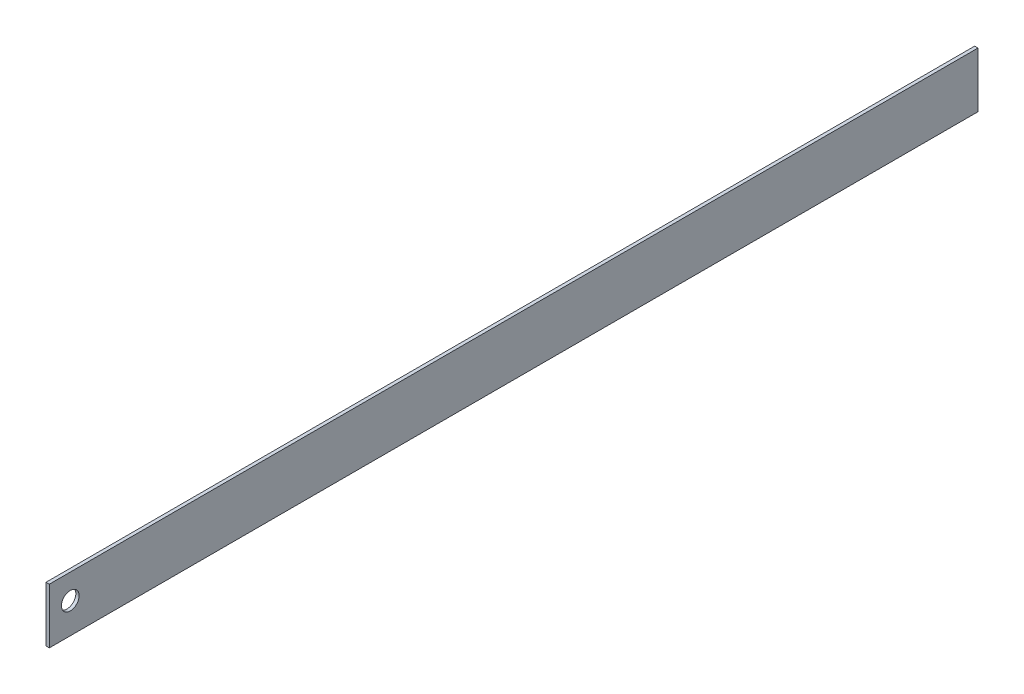
ISO-10303-21;
HEADER;
FILE_DESCRIPTION(('STEP AP214'),'2;1');
FILE_NAME('part.step','',(''),(''),'','','');
FILE_SCHEMA(('AUTOMOTIVE_DESIGN { 1 0 10303 214 1 1 1 1 }'));
ENDSEC;
DATA;
#1=APPLICATION_CONTEXT('core data for automotive mechanical design processes');
#2=APPLICATION_PROTOCOL_DEFINITION('international standard','automotive_design',2000,#1);
#3=PRODUCT_CONTEXT('',#1,'mechanical');
#4=PRODUCT('Part','Part','',(#3));
#5=PRODUCT_RELATED_PRODUCT_CATEGORY('part','',(#4));
#6=PRODUCT_DEFINITION_FORMATION('','',#4);
#7=PRODUCT_DEFINITION_CONTEXT('part definition',#1,'design');
#8=PRODUCT_DEFINITION('design','',#6,#7);
#9=PRODUCT_DEFINITION_SHAPE('','',#8);
#10=(LENGTH_UNIT() NAMED_UNIT(*) SI_UNIT(.MILLI.,.METRE.));
#11=(NAMED_UNIT(*) PLANE_ANGLE_UNIT() SI_UNIT($,.RADIAN.));
#12=(NAMED_UNIT(*) SI_UNIT($,.STERADIAN.) SOLID_ANGLE_UNIT());
#13=UNCERTAINTY_MEASURE_WITH_UNIT(LENGTH_MEASURE(1.E-05),#10,'distance_accuracy_value','');
#14=(GEOMETRIC_REPRESENTATION_CONTEXT(3) GLOBAL_UNCERTAINTY_ASSIGNED_CONTEXT((#13)) GLOBAL_UNIT_ASSIGNED_CONTEXT((#10,
#11,#12)) REPRESENTATION_CONTEXT('',''));
#15=CARTESIAN_POINT('',(0.,0.,0.));
#16=DIRECTION('',(0.,0.,1.));
#17=DIRECTION('',(1.,0.,0.));
#18=AXIS2_PLACEMENT_3D('',#15,#16,#17);
#19=CARTESIAN_POINT('',(0.3,0.,0.));
#20=DIRECTION('',(-1.,0.,0.));
#21=DIRECTION('',(0.,0.,1.));
#22=AXIS2_PLACEMENT_3D('',#19,#20,#21);
#23=PLANE('',#22);
#24=DIRECTION('',(0.,-1.,0.));
#25=VECTOR('',#24,1.);
#26=CARTESIAN_POINT('',(0.3,0.,0.));
#27=LINE('',#26,#25);
#28=CARTESIAN_POINT('',(0.3,5.,0.));
#29=VERTEX_POINT('',#28);
#30=CARTESIAN_POINT('',(0.3,0.,0.));
#31=VERTEX_POINT('',#30);
#32=EDGE_CURVE('E92',#29,#31,#27,.T.);
#33=ORIENTED_EDGE('',*,*,#32,.T.);
#34=DIRECTION('',(0.,0.,-1.));
#35=VECTOR('',#34,1.);
#36=CARTESIAN_POINT('',(0.3,0.,0.));
#37=LINE('',#36,#35);
#38=CARTESIAN_POINT('',(0.3,0.,-84.1));
#39=VERTEX_POINT('',#38);
#40=EDGE_CURVE('E87',#31,#39,#37,.T.);
#41=ORIENTED_EDGE('',*,*,#40,.T.);
#42=DIRECTION('',(0.,1.,0.));
#43=VECTOR('',#42,1.);
#44=CARTESIAN_POINT('',(0.3,0.,-84.1));
#45=LINE('',#44,#43);
#46=CARTESIAN_POINT('',(0.3,5.,-84.1));
#47=VERTEX_POINT('',#46);
#48=EDGE_CURVE('E90',#39,#47,#45,.T.);
#49=ORIENTED_EDGE('',*,*,#48,.T.);
#50=DIRECTION('',(0.,0.,1.));
#51=VECTOR('',#50,1.);
#52=CARTESIAN_POINT('',(0.3,5.,0.));
#53=LINE('',#52,#51);
#54=EDGE_CURVE('E57',#47,#29,#53,.T.);
#55=ORIENTED_EDGE('',*,*,#54,.T.);
#56=EDGE_LOOP('',(#33,#41,#49,#55));
#57=FACE_BOUND('',#56,.T.);
#58=CARTESIAN_POINT('',(0.3,2.755,-1.8995));
#59=DIRECTION('',(1.,0.,0.));
#60=DIRECTION('',(0.,0.,-1.));
#61=AXIS2_PLACEMENT_3D('',#58,#59,#60);
#62=CIRCLE('',#61,0.800000000000001);
#63=CARTESIAN_POINT('',(0.3,2.755,-2.6995));
#64=VERTEX_POINT('',#63);
#65=EDGE_CURVE('E112',#64,#64,#62,.T.);
#66=ORIENTED_EDGE('',*,*,#65,.F.);
#67=EDGE_LOOP('',(#66));
#68=FACE_BOUND('',#67,.T.);
#69=ADVANCED_FACE('F39',(#57,#68),#23,.F.);
#70=CARTESIAN_POINT('',(0.,0.,0.));
#71=DIRECTION('',(-1.,0.,0.));
#72=DIRECTION('',(0.,0.,1.));
#73=AXIS2_PLACEMENT_3D('',#70,#71,#72);
#74=PLANE('',#73);
#75=DIRECTION('',(0.,-1.,0.));
#76=VECTOR('',#75,1.);
#77=CARTESIAN_POINT('',(0.,0.,0.));
#78=LINE('',#77,#76);
#79=CARTESIAN_POINT('',(0.,5.,0.));
#80=VERTEX_POINT('',#79);
#81=CARTESIAN_POINT('',(0.,0.,0.));
#82=VERTEX_POINT('',#81);
#83=EDGE_CURVE('E108',#80,#82,#78,.T.);
#84=ORIENTED_EDGE('',*,*,#83,.F.);
#85=DIRECTION('',(0.,0.,1.));
#86=VECTOR('',#85,1.);
#87=CARTESIAN_POINT('',(0.,5.,0.));
#88=LINE('',#87,#86);
#89=CARTESIAN_POINT('',(0.,5.,-84.1));
#90=VERTEX_POINT('',#89);
#91=EDGE_CURVE('E80',#90,#80,#88,.T.);
#92=ORIENTED_EDGE('',*,*,#91,.F.);
#93=DIRECTION('',(0.,1.,0.));
#94=VECTOR('',#93,1.);
#95=CARTESIAN_POINT('',(0.,0.,-84.1));
#96=LINE('',#95,#94);
#97=CARTESIAN_POINT('',(0.,0.,-84.1));
#98=VERTEX_POINT('',#97);
#99=EDGE_CURVE('E74',#98,#90,#96,.T.);
#100=ORIENTED_EDGE('',*,*,#99,.F.);
#101=DIRECTION('',(0.,0.,-1.));
#102=VECTOR('',#101,1.);
#103=CARTESIAN_POINT('',(0.,0.,0.));
#104=LINE('',#103,#102);
#105=EDGE_CURVE('E97',#82,#98,#104,.T.);
#106=ORIENTED_EDGE('',*,*,#105,.F.);
#107=EDGE_LOOP('',(#84,#92,#100,#106));
#108=FACE_BOUND('',#107,.T.);
#109=CARTESIAN_POINT('',(0.,2.755,-1.8995));
#110=DIRECTION('',(1.,0.,0.));
#111=DIRECTION('',(0.,0.,-1.));
#112=AXIS2_PLACEMENT_3D('',#109,#110,#111);
#113=CIRCLE('',#112,0.800000000000001);
#114=CARTESIAN_POINT('',(0.,2.755,-2.6995));
#115=VERTEX_POINT('',#114);
#116=EDGE_CURVE('E130',#115,#115,#113,.T.);
#117=ORIENTED_EDGE('',*,*,#116,.T.);
#118=EDGE_LOOP('',(#117));
#119=FACE_BOUND('',#118,.T.);
#120=ADVANCED_FACE('F125',(#108,#119),#74,.T.);
#121=CARTESIAN_POINT('',(0.3,0.,0.));
#122=DIRECTION('',(0.,0.,-1.));
#123=DIRECTION('',(-1.,0.,0.));
#124=AXIS2_PLACEMENT_3D('',#121,#122,#123);
#125=PLANE('',#124);
#126=ORIENTED_EDGE('',*,*,#83,.T.);
#127=DIRECTION('',(-1.,0.,0.));
#128=VECTOR('',#127,1.);
#129=CARTESIAN_POINT('',(0.3,0.,0.));
#130=LINE('',#129,#128);
#131=EDGE_CURVE('E11',#31,#82,#130,.T.);
#132=ORIENTED_EDGE('',*,*,#131,.F.);
#133=ORIENTED_EDGE('',*,*,#32,.F.);
#134=DIRECTION('',(-1.,0.,0.));
#135=VECTOR('',#134,1.);
#136=CARTESIAN_POINT('',(0.3,5.,0.));
#137=LINE('',#136,#135);
#138=EDGE_CURVE('E104',#29,#80,#137,.T.);
#139=ORIENTED_EDGE('',*,*,#138,.T.);
#140=EDGE_LOOP('',(#126,#132,#133,#139));
#141=FACE_BOUND('',#140,.T.);
#142=ADVANCED_FACE('F41',(#141),#125,.F.);
#143=CARTESIAN_POINT('',(0.3,0.,0.));
#144=DIRECTION('',(0.,1.,0.));
#145=DIRECTION('',(0.,0.,1.));
#146=AXIS2_PLACEMENT_3D('',#143,#144,#145);
#147=PLANE('',#146);
#148=ORIENTED_EDGE('',*,*,#105,.T.);
#149=DIRECTION('',(-1.,0.,0.));
#150=VECTOR('',#149,1.);
#151=CARTESIAN_POINT('',(0.3,0.,-84.1));
#152=LINE('',#151,#150);
#153=EDGE_CURVE('E49',#39,#98,#152,.T.);
#154=ORIENTED_EDGE('',*,*,#153,.F.);
#155=ORIENTED_EDGE('',*,*,#40,.F.);
#156=ORIENTED_EDGE('',*,*,#131,.T.);
#157=EDGE_LOOP('',(#148,#154,#155,#156));
#158=FACE_BOUND('',#157,.T.);
#159=ADVANCED_FACE('F96',(#158),#147,.F.);
#160=CARTESIAN_POINT('',(0.3,0.,-84.1));
#161=DIRECTION('',(0.,0.,1.));
#162=DIRECTION('',(1.,0.,0.));
#163=AXIS2_PLACEMENT_3D('',#160,#161,#162);
#164=PLANE('',#163);
#165=ORIENTED_EDGE('',*,*,#99,.T.);
#166=DIRECTION('',(-1.,0.,0.));
#167=VECTOR('',#166,1.);
#168=CARTESIAN_POINT('',(0.3,5.,-84.1));
#169=LINE('',#168,#167);
#170=EDGE_CURVE('E99',#47,#90,#169,.T.);
#171=ORIENTED_EDGE('',*,*,#170,.F.);
#172=ORIENTED_EDGE('',*,*,#48,.F.);
#173=ORIENTED_EDGE('',*,*,#153,.T.);
#174=EDGE_LOOP('',(#165,#171,#172,#173));
#175=FACE_BOUND('',#174,.T.);
#176=ADVANCED_FACE('F100',(#175),#164,.F.);
#177=CARTESIAN_POINT('',(0.3,5.,0.));
#178=DIRECTION('',(0.,-1.,0.));
#179=DIRECTION('',(0.,0.,-1.));
#180=AXIS2_PLACEMENT_3D('',#177,#178,#179);
#181=PLANE('',#180);
#182=ORIENTED_EDGE('',*,*,#91,.T.);
#183=ORIENTED_EDGE('',*,*,#138,.F.);
#184=ORIENTED_EDGE('',*,*,#54,.F.);
#185=ORIENTED_EDGE('',*,*,#170,.T.);
#186=EDGE_LOOP('',(#182,#183,#184,#185));
#187=FACE_BOUND('',#186,.T.);
#188=ADVANCED_FACE('F122',(#187),#181,.F.);
#189=CARTESIAN_POINT('',(0.3,2.755,-1.8995));
#190=DIRECTION('',(-1.,0.,0.));
#191=DIRECTION('',(0.,0.,1.));
#192=AXIS2_PLACEMENT_3D('',#189,#190,#191);
#193=CYLINDRICAL_SURFACE('',#192,0.800000000000001);
#194=ORIENTED_EDGE('',*,*,#65,.T.);
#195=EDGE_LOOP('',(#194));
#196=FACE_BOUND('',#195,.T.);
#197=ORIENTED_EDGE('',*,*,#116,.F.);
#198=EDGE_LOOP('',(#197));
#199=FACE_BOUND('',#198,.T.);
#200=ADVANCED_FACE('F138',(#196,#199),#193,.F.);
#201=CLOSED_SHELL('',(#69,#120,#142,#159,#176,#188,#200));
#202=MANIFOLD_SOLID_BREP('B2',#201);
#203=ADVANCED_BREP_SHAPE_REPRESENTATION('',(#18,#202),#14);
#204=SHAPE_DEFINITION_REPRESENTATION(#9,#203);
ENDSEC;
END-ISO-10303-21;
